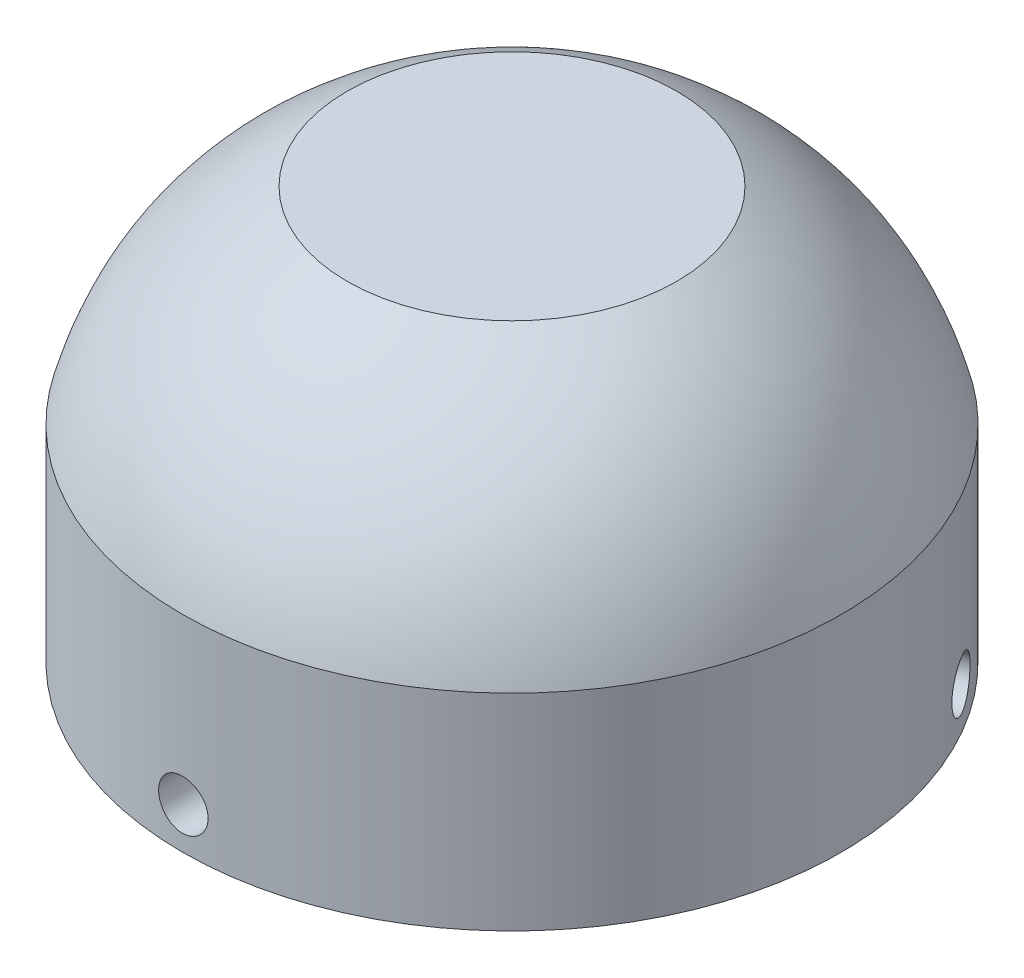
ISO-10303-21;
HEADER;
FILE_DESCRIPTION(('STEP AP214'),'2;1');
FILE_NAME('part.step','',(''),(''),'','','');
FILE_SCHEMA(('AUTOMOTIVE_DESIGN { 1 0 10303 214 1 1 1 1 }'));
ENDSEC;
DATA;
#1=APPLICATION_CONTEXT('core data for automotive mechanical design processes');
#2=APPLICATION_PROTOCOL_DEFINITION('international standard','automotive_design',2000,#1);
#3=PRODUCT_CONTEXT('',#1,'mechanical');
#4=PRODUCT('Part','Part','',(#3));
#5=PRODUCT_RELATED_PRODUCT_CATEGORY('part','',(#4));
#6=PRODUCT_DEFINITION_FORMATION('','',#4);
#7=PRODUCT_DEFINITION_CONTEXT('part definition',#1,'design');
#8=PRODUCT_DEFINITION('design','',#6,#7);
#9=PRODUCT_DEFINITION_SHAPE('','',#8);
#10=(LENGTH_UNIT() NAMED_UNIT(*) SI_UNIT(.MILLI.,.METRE.));
#11=(NAMED_UNIT(*) PLANE_ANGLE_UNIT() SI_UNIT($,.RADIAN.));
#12=(NAMED_UNIT(*) SI_UNIT($,.STERADIAN.) SOLID_ANGLE_UNIT());
#13=UNCERTAINTY_MEASURE_WITH_UNIT(LENGTH_MEASURE(1.E-05),#10,'distance_accuracy_value','');
#14=(GEOMETRIC_REPRESENTATION_CONTEXT(3) GLOBAL_UNCERTAINTY_ASSIGNED_CONTEXT((#13)) GLOBAL_UNIT_ASSIGNED_CONTEXT((#10,
#11,#12)) REPRESENTATION_CONTEXT('',''));
#15=CARTESIAN_POINT('',(0.,0.,0.));
#16=DIRECTION('',(0.,0.,1.));
#17=DIRECTION('',(1.,0.,0.));
#18=AXIS2_PLACEMENT_3D('',#15,#16,#17);
#19=CARTESIAN_POINT('',(-20.,30.,0.));
#20=CARTESIAN_POINT('',(-35.4489346182835,21.9814307012014,0.));
#21=CARTESIAN_POINT('',(-40.,5.,0.));
#22=B_SPLINE_CURVE_WITH_KNOTS('',2,(#19,#20,#21),.UNSPECIFIED.,.F.,.F.,(3,3),(0.,1.),.UNSPECIFIED.);
#23=CARTESIAN_POINT('',(0.,-63.9534883720931,0.));
#24=DIRECTION('',(0.,-1.,0.));
#25=AXIS1_PLACEMENT('',#23,#24);
#26=SURFACE_OF_REVOLUTION('',#22,#25);
#27=CARTESIAN_POINT('',(0.,5.,0.));
#28=DIRECTION('',(0.,-1.,0.));
#29=DIRECTION('',(0.,0.,-1.));
#30=AXIS2_PLACEMENT_3D('',#27,#28,#29);
#31=CIRCLE('',#30,40.);
#32=CARTESIAN_POINT('',(0.,5.,-40.));
#33=VERTEX_POINT('',#32);
#34=EDGE_CURVE('E53',#33,#33,#31,.T.);
#35=ORIENTED_EDGE('',*,*,#34,.F.);
#36=EDGE_LOOP('',(#35));
#37=FACE_BOUND('',#36,.T.);
#38=CARTESIAN_POINT('',(0.,30.,0.));
#39=DIRECTION('',(0.,-1.,0.));
#40=DIRECTION('',(0.,0.,-1.));
#41=AXIS2_PLACEMENT_3D('',#38,#39,#40);
#42=CIRCLE('',#41,20.);
#43=CARTESIAN_POINT('',(0.,30.,-20.));
#44=VERTEX_POINT('',#43);
#45=EDGE_CURVE('E10',#44,#44,#42,.T.);
#46=ORIENTED_EDGE('',*,*,#45,.T.);
#47=EDGE_LOOP('',(#46));
#48=FACE_BOUND('',#47,.T.);
#49=ADVANCED_FACE('F30',(#37,#48),#26,.T.);
#50=CARTESIAN_POINT('',(-20.,30.,0.));
#51=DIRECTION('',(0.,-1.,0.));
#52=DIRECTION('',(0.,0.,-1.));
#53=AXIS2_PLACEMENT_3D('',#50,#51,#52);
#54=PLANE('',#53);
#55=ORIENTED_EDGE('',*,*,#45,.F.);
#56=EDGE_LOOP('',(#55));
#57=FACE_BOUND('',#56,.T.);
#58=ADVANCED_FACE('F77',(#57),#54,.F.);
#59=CARTESIAN_POINT('',(0.,22.9289321881345,0.));
#60=DIRECTION('',(0.,1.,0.));
#61=DIRECTION('',(0.,0.,1.));
#62=AXIS2_PLACEMENT_3D('',#59,#60,#61);
#63=PLANE('',#62);
#64=CARTESIAN_POINT('',(0.,22.9289321881345,0.));
#65=DIRECTION('',(0.,-1.,0.));
#66=DIRECTION('',(0.,0.,-1.));
#67=AXIS2_PLACEMENT_3D('',#64,#65,#66);
#68=CIRCLE('',#67,20.);
#69=CARTESIAN_POINT('',(0.,22.9289321881345,-20.));
#70=VERTEX_POINT('',#69);
#71=EDGE_CURVE('E37',#70,#70,#68,.T.);
#72=ORIENTED_EDGE('',*,*,#71,.T.);
#73=EDGE_LOOP('',(#72));
#74=FACE_BOUND('',#73,.T.);
#75=ADVANCED_FACE('F73',(#74),#63,.F.);
#76=CARTESIAN_POINT('',(-35.,0.,0.));
#77=CARTESIAN_POINT('',(-32.9925107798446,14.5797364340656,0.));
#78=CARTESIAN_POINT('',(-20.,22.9289321881345,0.));
#79=B_SPLINE_CURVE_WITH_KNOTS('',2,(#76,#77,#78),.UNSPECIFIED.,.F.,.F.,(3,3),(0.,1.),.UNSPECIFIED.);
#80=CARTESIAN_POINT('',(0.,-63.9534883720931,0.));
#81=DIRECTION('',(0.,-1.,0.));
#82=AXIS1_PLACEMENT('',#80,#81);
#83=SURFACE_OF_REVOLUTION('',#79,#82);
#84=ORIENTED_EDGE('',*,*,#71,.F.);
#85=EDGE_LOOP('',(#84));
#86=FACE_BOUND('',#85,.T.);
#87=CARTESIAN_POINT('',(0.,0.,0.));
#88=DIRECTION('',(0.,-1.,0.));
#89=DIRECTION('',(0.,0.,-1.));
#90=AXIS2_PLACEMENT_3D('',#87,#88,#89);
#91=CIRCLE('',#90,35.);
#92=CARTESIAN_POINT('',(0.,0.,-35.));
#93=VERTEX_POINT('',#92);
#94=EDGE_CURVE('E41',#93,#93,#91,.T.);
#95=ORIENTED_EDGE('',*,*,#94,.T.);
#96=EDGE_LOOP('',(#95));
#97=FACE_BOUND('',#96,.T.);
#98=ADVANCED_FACE('F68',(#86,#97),#83,.T.);
#99=CARTESIAN_POINT('',(0.,-63.9534883720931,0.));
#100=DIRECTION('',(0.,-1.,0.));
#101=DIRECTION('',(0.,0.,-1.));
#102=AXIS2_PLACEMENT_3D('',#99,#100,#101);
#103=CYLINDRICAL_SURFACE('',#102,35.);
#104=CARTESIAN_POINT('',(-31.6993377410829,-15.,-14.8375195628095));
#105=CARTESIAN_POINT('',(-31.6993355474285,-15.1681788977969,-14.8375267706995));
#106=CARTESIAN_POINT('',(-31.6933079127272,-15.3364718555865,-14.8504230419554));
#107=CARTESIAN_POINT('',(-31.6692637457543,-15.668400071108,-14.9016275265098));
#108=CARTESIAN_POINT('',(-31.6512336780235,-15.8320298525538,-14.9399644297251));
#109=CARTESIAN_POINT('',(-31.6034490090532,-16.1497763164806,-15.0407813611578));
#110=CARTESIAN_POINT('',(-31.5737011153164,-16.3038983830823,-15.1032475769103));
#111=CARTESIAN_POINT('',(-31.5029384740131,-16.5983417986807,-15.2502948544938));
#112=CARTESIAN_POINT('',(-31.4619261125039,-16.7386660618111,-15.3348712327325));
#113=CARTESIAN_POINT('',(-31.3691852996159,-17.0019468210089,-15.5237003256633));
#114=CARTESIAN_POINT('',(-31.3174313409714,-17.1248607834929,-15.6279998219832));
#115=CARTESIAN_POINT('',(-31.2041875525536,-17.3494663357357,-15.8529018638792));
#116=CARTESIAN_POINT('',(-31.1426972950232,-17.4511569926087,-15.9735051257153));
#117=CARTESIAN_POINT('',(-31.0110951669304,-17.6305716963779,-16.2275209844633));
#118=CARTESIAN_POINT('',(-30.9409702379859,-17.7082588039076,-16.3609529139425));
#119=CARTESIAN_POINT('',(-30.7937213671833,-17.8372248736093,-16.6364386863232));
#120=CARTESIAN_POINT('',(-30.7165975541843,-17.8885043218666,-16.7784923704705));
#121=CARTESIAN_POINT('',(-30.5574353417916,-17.9630766244091,-17.0666386367993));
#122=CARTESIAN_POINT('',(-30.4754095859762,-17.9864384709037,-17.2127203457848));
#123=CARTESIAN_POINT('',(-30.3084643635952,-18.0047257169121,-17.5050080891657));
#124=CARTESIAN_POINT('',(-30.2235449536737,-17.9996516727498,-17.6512141210729));
#125=CARTESIAN_POINT('',(-30.0534929178141,-17.9612675389711,-17.9392158507807));
#126=CARTESIAN_POINT('',(-29.9683614375479,-17.9280316396164,-18.0810221228558));
#127=CARTESIAN_POINT('',(-29.8002772342064,-17.834382628761,-18.3567307075397));
#128=CARTESIAN_POINT('',(-29.7173245328857,-17.7739692460094,-18.4906329412455));
#129=CARTESIAN_POINT('',(-29.55618139008,-17.627597672851,-18.7471368054528));
#130=CARTESIAN_POINT('',(-29.477997293087,-17.5416063081392,-18.8697234876029));
#131=CARTESIAN_POINT('',(-29.329165252444,-17.3465438378033,-19.1002334962758));
#132=CARTESIAN_POINT('',(-29.2585174707027,-17.2374722364782,-19.208156507781));
#133=CARTESIAN_POINT('',(-29.1270479808863,-16.9989274115879,-19.4069408928311));
#134=CARTESIAN_POINT('',(-29.0662586003546,-16.8693897117684,-19.4977462864927));
#135=CARTESIAN_POINT('',(-28.9570303549841,-16.593814336155,-19.6596021787964));
#136=CARTESIAN_POINT('',(-28.9085915012042,-16.4477766455869,-19.7306526597495));
#137=CARTESIAN_POINT('',(-28.8259114332634,-16.1433008088582,-19.851251929562));
#138=CARTESIAN_POINT('',(-28.7916721174494,-15.9848610080139,-19.9007978435008));
#139=CARTESIAN_POINT('',(-28.7387492014963,-15.6601005113749,-19.9771487298717));
#140=CARTESIAN_POINT('',(-28.7200652550904,-15.4937799910943,-20.0039542085124));
#141=CARTESIAN_POINT('',(-28.6990351966099,-15.1585451904919,-20.034113967633));
#142=CARTESIAN_POINT('',(-28.6966373460487,-14.9896408341738,-20.0375425132618));
#143=CARTESIAN_POINT('',(-28.7081384662056,-14.6535358314843,-20.0210609820554));
#144=CARTESIAN_POINT('',(-28.72203727597,-14.4863351683029,-20.0011511357218));
#145=CARTESIAN_POINT('',(-28.7655415502781,-14.1586431948189,-19.9385318969368));
#146=CARTESIAN_POINT('',(-28.795123020415,-13.9981420378853,-19.8958573337914));
#147=CARTESIAN_POINT('',(-28.8688165582247,-13.6880999611053,-19.7887753633423));
#148=CARTESIAN_POINT('',(-28.9129288723111,-13.538559227178,-19.7243675874873));
#149=CARTESIAN_POINT('',(-29.0141241073333,-13.2542704319917,-19.5752066212797));
#150=CARTESIAN_POINT('',(-29.0712393280241,-13.1195604686071,-19.4904027360352));
#151=CARTESIAN_POINT('',(-29.1962526638784,-12.8691423551176,-19.302629847062));
#152=CARTESIAN_POINT('',(-29.264150975257,-12.7534345508645,-19.1996605127808));
#153=CARTESIAN_POINT('',(-29.408483781682,-12.5439970271157,-18.9778450451139));
#154=CARTESIAN_POINT('',(-29.4849402660236,-12.450325934563,-18.858957851517));
#155=CARTESIAN_POINT('',(-29.64359052085,-12.2880232282786,-18.6085860631289));
#156=CARTESIAN_POINT('',(-29.7257842311431,-12.2193913518968,-18.4771016004956));
#157=CARTESIAN_POINT('',(-29.8930681082947,-12.1092157912916,-18.2052162901554));
#158=CARTESIAN_POINT('',(-29.9781542500806,-12.067635964639,-18.0648276152972));
#159=CARTESIAN_POINT('',(-30.1486478856728,-12.0126266986178,-17.7788282380026));
#160=CARTESIAN_POINT('',(-30.234055372974,-11.9991966924382,-17.6332176407723));
#161=CARTESIAN_POINT('',(-30.4023938789932,-12.0008750821372,-17.3413591599725));
#162=CARTESIAN_POINT('',(-30.4853319569704,-12.0158921579829,-17.1951148142023));
#163=CARTESIAN_POINT('',(-30.6467547280445,-12.0738478591427,-16.9057352857155));
#164=CARTESIAN_POINT('',(-30.7252394153858,-12.1167865205418,-16.7626001070173));
#165=CARTESIAN_POINT('',(-30.8757911074189,-12.2293430218768,-16.4836483809795));
#166=CARTESIAN_POINT('',(-30.947858540913,-12.298959077572,-16.3478313448797));
#167=CARTESIAN_POINT('',(-31.0839547837021,-12.4628838846323,-16.0875526619888));
#168=CARTESIAN_POINT('',(-31.1479837094471,-12.5571922782303,-15.9630908507072));
#169=CARTESIAN_POINT('',(-31.2668889101178,-12.7681675615409,-15.7289219638973));
#170=CARTESIAN_POINT('',(-31.3217365219968,-12.8849021138727,-15.6192612949511));
#171=CARTESIAN_POINT('',(-31.4210438574192,-13.1372917927201,-15.4185142419734));
#172=CARTESIAN_POINT('',(-31.465501065205,-13.2729514887808,-15.3274323569737));
#173=CARTESIAN_POINT('',(-31.5433425985919,-13.5596186650064,-15.1665936200246));
#174=CARTESIAN_POINT('',(-31.5767050499487,-13.7106557064792,-15.096878916213));
#175=CARTESIAN_POINT('',(-31.6316899560069,-14.0234732227605,-14.9813324820185));
#176=CARTESIAN_POINT('',(-31.653325875478,-14.1852411353663,-14.9354733623551));
#177=CARTESIAN_POINT('',(-31.6790654713475,-14.4566320780792,-14.8807707644004));
#178=CARTESIAN_POINT('',(-31.6866617646195,-14.564510957119,-14.8645757059903));
#179=CARTESIAN_POINT('',(-31.6967986046329,-14.781577186907,-14.8429477798276));
#180=CARTESIAN_POINT('',(-31.6993391659042,-14.890764533894,-14.8375148811447));
#181=CARTESIAN_POINT('',(-31.6993377410829,-15.,-14.8375195628095));
#182=B_SPLINE_CURVE_WITH_KNOTS('',3,(#104,#105,#106,#107,#108,#109,#110,#111,#112,#113,#114,
#115,#116,#117,#118,#119,#120,#121,#122,#123,#124,#125,#126,#127,#128,#129,#130,#131,#132,#133,
#134,#135,#136,#137,#138,#139,#140,#141,#142,#143,#144,#145,#146,#147,#148,#149,#150,#151,#152,
#153,#154,#155,#156,#157,#158,#159,#160,#161,#162,#163,#164,#165,#166,#167,#168,#169,#170,#171,
#172,#173,#174,#175,#176,#177,#178,#179,#180,#181),.UNSPECIFIED.,.T.,.F.,(4,2,2,2,2,2,2,2,2,2,2,
2,2,2,2,2,2,2,2,2,2,2,2,2,2,2,2,2,2,2,2,2,2,2,2,2,2,2,4),(0.,0.504137845154906,1.0088451851254,
1.51326404003696,2.01757613044269,2.52309976273197,3.02864561100071,3.5349656192069,
4.04127630725863,4.54633315507159,5.05138012191659,5.55510070289603,6.05882631148134,
6.56320811562687,7.06760075362891,7.57361533214637,8.07963036375614,8.58571302310648,
9.09178441661877,9.5962473420388,10.1007052851759,10.6043936277359,11.1080905122643,
11.6130525231886,12.1180237237333,12.6243235404852,13.1306180462274,13.6362347291713,
14.1418412311696,14.6458273992463,15.1498142186598,15.6537673362459,16.1577131524622,
16.6632040203355,17.1688171527569,17.6754213142689,18.1814425380561,18.5088908177618,
18.836338156391),.UNSPECIFIED.);
#183=CARTESIAN_POINT('',(-31.6993377410829,-15.,-14.8375195628095));
#184=VERTEX_POINT('',#183);
#185=EDGE_CURVE('E126',#184,#184,#182,.T.);
#186=ORIENTED_EDGE('',*,*,#185,.F.);
#187=EDGE_LOOP('',(#186));
#188=FACE_BOUND('',#187,.T.);
#189=CARTESIAN_POINT('',(28.6993377410832,-15.,-20.0336719855157));
#190=CARTESIAN_POINT('',(28.6993428864718,-15.1681788977969,-20.0336664818103));
#191=CARTESIAN_POINT('',(28.7074975676428,-15.3364718555865,-20.0219982614063));
#192=CARTESIAN_POINT('',(28.7398198685682,-15.668400071108,-19.9755731597177));
#193=CARTESIAN_POINT('',(28.7640055667897,-15.8320298525538,-19.9407902114232));
#194=CARTESIAN_POINT('',(28.8274232560568,-16.1497763164806,-19.8489990084672));
#195=CARTESIAN_POINT('',(28.8666466389084,-16.3038983830823,-19.7920034689058));
#196=CARTESIAN_POINT('',(28.9586119962014,-16.5983417986807,-19.6571975851065));
#197=CARTESIAN_POINT('',(29.0113511075616,-16.7386660618111,-19.579391649051));
#198=CARTESIAN_POINT('',(29.1285114925692,-17.0019468210089,-19.404661202657));
#199=CARTESIAN_POINT('',(29.1929605266619,-17.1248607834929,-19.3076912115644));
#200=CARTESIAN_POINT('',(29.331109514098,-17.3494663357357,-19.0971681930259));
#201=CARTESIAN_POINT('',(29.4048098738621,-17.4511569926087,-18.9836144370013));
#202=CARTESIAN_POINT('',(29.5589929964556,-17.6305716963779,-18.7426357215068));
#203=CARTESIAN_POINT('',(29.6394859725883,-17.7082588039076,-18.6151897868627));
#204=CARTESIAN_POINT('',(29.8044392144499,-17.8372248736093,-18.3499256378787));
#205=CARTESIAN_POINT('',(29.888899407123,-17.8885043218666,-18.2121076145111));
#206=CARTESIAN_POINT('',(30.0588602875731,-17.9630766244092,-17.9301959620922));
#207=CARTESIAN_POINT('',(30.144357880675,-17.9864384709037,-17.7861187192987));
#208=CARTESIAN_POINT('',(30.3140138804673,-18.0047257169121,-17.4953960439858));
#209=CARTESIAN_POINT('',(30.3981723133247,-17.9996516727498,-17.3487506617658));
#210=CARTESIAN_POINT('',(30.5625631096557,-17.9612675389711,-17.0574804138922));
#211=CARTESIAN_POINT('',(30.6428052035556,-17.9280316396164,-16.9128512532824));
#212=CARTESIAN_POINT('',(30.7975337402626,-17.834382628761,-16.6294317708718));
#213=CARTESIAN_POINT('',(30.8720201256149,-17.7739692460094,-16.4906415073626));
#214=CARTESIAN_POINT('',(31.0135874167845,-17.627597672851,-16.2228355199436));
#215=CARTESIAN_POINT('',(31.0806585491956,-17.5416063081392,-16.0938327647007));
#216=CARTESIAN_POINT('',(31.2058700522114,-17.3465438378033,-15.8496854322703));
#217=CARTESIAN_POINT('',(31.2640102309571,-17.2374722364782,-15.7345411528087));
#218=CARTESIAN_POINT('',(31.370427813378,-16.9989274115879,-15.5212930422801));
#219=CARTESIAN_POINT('',(31.4186729008238,-16.8693897117684,-15.4232451976285));
#220=CARTESIAN_POINT('',(31.5042300926257,-16.593814336155,-15.247722816175));
#221=CARTESIAN_POINT('',(31.5415421871923,-16.4477766455869,-15.1702482977949));
#222=CARTESIAN_POINT('',(31.6046441845573,-16.1433008088582,-15.0383456236652));
#223=CARTESIAN_POINT('',(31.630432546775,-15.9848610080139,-14.9839205493927));
#224=CARTESIAN_POINT('',(31.6700928959972,-15.6601005113749,-14.8999125165495));
#225=CARTESIAN_POINT('',(31.6839651482577,-15.4937799910943,-14.8703290049988));
#226=CARTESIAN_POINT('',(31.6995692365879,-15.1585451904919,-14.8370365605512));
#227=CARTESIAN_POINT('',(31.7013395189198,-14.9896408341738,-14.8332456882364));
#228=CARTESIAN_POINT('',(31.6928166542803,-14.6535358314843,-14.8514467160674));
#229=CARTESIAN_POINT('',(31.6825236264521,-14.4863351683029,-14.8734383615725));
#230=CARTESIAN_POINT('',(31.6500459120528,-14.1586431948189,-14.9424237876891));
#231=CARTESIAN_POINT('',(31.6278793913418,-13.9981420378853,-14.9893793738816));
#232=CARTESIAN_POINT('',(31.5719904535505,-13.6880999611053,-15.1067408349441));
#233=CARTESIAN_POINT('',(31.538267840502,-13.538559227178,-15.1771471074902));
#234=CARTESIAN_POINT('',(31.4596882720242,-13.2542704319917,-15.3393652348652));
#235=CARTESIAN_POINT('',(31.4148035634084,-13.1195604686071,-15.4312304095484));
#236=CARTESIAN_POINT('',(31.3146941393427,-12.8691423551176,-15.6333815786967));
#237=CARTESIAN_POINT('',(31.2594692357337,-12.7534345508645,-15.7436679083651));
#238=CARTESIAN_POINT('',(31.1395378089943,-12.5439970271157,-15.9795715191622));
#239=CARTESIAN_POINT('',(31.0748067213256,-12.450325934563,-16.1052283736845));
#240=CARTESIAN_POINT('',(30.9373035196037,-12.2880232282786,-16.3678094188751));
#241=CARTESIAN_POINT('',(30.864531489907,-12.2193913518968,-16.5047334913369));
#242=CARTESIAN_POINT('',(30.7127138428123,-12.1092157912916,-16.7855482337638));
#243=CARTESIAN_POINT('',(30.6336767548744,-12.067635964639,-16.9294293314895));
#244=CARTESIAN_POINT('',(30.4712408464668,-12.0126266986178,-17.2200808397433));
#245=CARTESIAN_POINT('',(30.3878421138558,-11.9991966924382,-17.3668511920346));
#246=CARTESIAN_POINT('',(30.2192545081828,-12.0008750821372,-17.6585658550822));
#247=CARTESIAN_POINT('',(30.1340722285746,-12.0158921579829,-17.8035145104366));
#248=CARTESIAN_POINT('',(29.9641735911069,-12.0738478591427,-18.0880004951795));
#249=CARTESIAN_POINT('',(29.8794572338497,-12.1167865205418,-18.2275378175742));
#250=CARTESIAN_POINT('',(29.713153798688,-12.2293430218768,-18.4973952704765));
#251=CARTESIAN_POINT('',(29.631566511906,-12.298959077572,-18.6277160167179));
#252=CARTESIAN_POINT('',(29.4742066818535,-12.4628838846323,-18.8757181617783));
#253=CARTESIAN_POINT('',(29.398434054355,-12.5571922782303,-18.9933997436913));
#254=CARTESIAN_POINT('',(29.2550904499371,-12.7681675615409,-19.2134591115192));
#255=CARTESIAN_POINT('',(29.1875453307732,-12.8849021138727,-19.3157888712164));
#256=CARTESIAN_POINT('',(29.0633469508708,-13.1372917927201,-19.5021650729632));
#257=CARTESIAN_POINT('',(29.0066963285294,-13.2729514887808,-19.5862070867868));
#258=CARTESIAN_POINT('',(28.9063266631123,-13.5596186650063,-19.734039200644));
#259=CARTESIAN_POINT('',(28.8626331842726,-13.7106557064792,-19.7977892829573));
#260=CARTESIAN_POINT('',(28.7900594899725,-14.0234732227605,-19.9031808255257));
#261=CARTESIAN_POINT('',(28.7611622870844,-14.1852411353663,-19.9448476412536));
#262=CARTESIAN_POINT('',(28.7266582455373,-14.4566320780792,-19.994490084137));
#263=CARTESIAN_POINT('',(28.7164310601745,-14.564510957119,-20.0091661962902));
#264=CARTESIAN_POINT('',(28.702769146693,-14.781577186907,-20.0287589203373));
#265=CARTESIAN_POINT('',(28.6993343990532,-14.890764533894,-20.0336755602795));
#266=CARTESIAN_POINT('',(28.6993377410832,-15.,-20.0336719855157));
#267=B_SPLINE_CURVE_WITH_KNOTS('',3,(#189,#190,#191,#192,#193,#194,#195,#196,#197,#198,#199,
#200,#201,#202,#203,#204,#205,#206,#207,#208,#209,#210,#211,#212,#213,#214,#215,#216,#217,#218,
#219,#220,#221,#222,#223,#224,#225,#226,#227,#228,#229,#230,#231,#232,#233,#234,#235,#236,#237,
#238,#239,#240,#241,#242,#243,#244,#245,#246,#247,#248,#249,#250,#251,#252,#253,#254,#255,#256,
#257,#258,#259,#260,#261,#262,#263,#264,#265,#266),.UNSPECIFIED.,.T.,.F.,(4,2,2,2,2,2,2,2,2,2,2,
2,2,2,2,2,2,2,2,2,2,2,2,2,2,2,2,2,2,2,2,2,2,2,2,2,2,2,4),(0.,0.504137845154905,1.00884518512539,
1.51326404003695,2.01757613044268,2.52309976273196,3.02864561100069,3.53496561920689,
4.04127630725862,4.54633315507159,5.0513801219166,5.55510070289604,6.05882631148134,
6.56320811562687,7.06760075362892,7.57361533214637,8.07963036375613,8.58571302310648,
9.09178441661877,9.5962473420388,10.1007052851759,10.6043936277359,11.1080905122643,
11.6130525231886,12.1180237237333,12.6243235404852,13.1306180462274,13.6362347291713,
14.1418412311696,14.6458273992463,15.1498142186598,15.6537673362459,16.1577131524622,
16.6632040203355,17.1688171527569,17.6754213142688,18.1814425380561,18.5088908177617,
18.836338156391),.UNSPECIFIED.);
#268=CARTESIAN_POINT('',(28.6993377410832,-15.,-20.0336719855157));
#269=VERTEX_POINT('',#268);
#270=EDGE_CURVE('E131',#269,#269,#267,.T.);
#271=ORIENTED_EDGE('',*,*,#270,.F.);
#272=EDGE_LOOP('',(#271));
#273=FACE_BOUND('',#272,.T.);
#274=CARTESIAN_POINT('',(3.,-15.,34.8711915483254));
#275=CARTESIAN_POINT('',(2.99999266095691,-15.1681788977969,34.8711932525099));
#276=CARTESIAN_POINT('',(2.98581034508464,-15.3364718555865,34.8724213033618));
#277=CARTESIAN_POINT('',(2.92944387718635,-15.668400071108,34.8772006862277));
#278=CARTESIAN_POINT('',(2.88722811123404,-15.8320298525538,34.8807546411484));
#279=CARTESIAN_POINT('',(2.77602575299662,-16.1497763164806,34.8897803696251));
#280=CARTESIAN_POINT('',(2.70705447640827,-16.3038983830823,34.8952510458163));
#281=CARTESIAN_POINT('',(2.54432647781201,-16.5983417986807,34.9074924396004));
#282=CARTESIAN_POINT('',(2.45057500494258,-16.7386660618111,34.9142628817836));
#283=CARTESIAN_POINT('',(2.24067380704696,-17.0019468210089,34.9283615283204));
#284=CARTESIAN_POINT('',(2.12447081430968,-17.1248607834929,34.9356910335478));
#285=CARTESIAN_POINT('',(1.87307803845591,-17.3494663357357,34.9500700569052));
#286=CARTESIAN_POINT('',(1.73788742116142,-17.4511569926087,34.9571195627167));
#287=CARTESIAN_POINT('',(1.45210217047511,-17.6305716963779,34.9701567059702));
#288=CARTESIAN_POINT('',(1.3014842653979,-17.7082588039076,34.9761427008053));
#289=CARTESIAN_POINT('',(0.98928215273371,-17.8372248736093,34.9863643242021));
#290=CARTESIAN_POINT('',(0.827698147061469,-17.8885043218666,34.9905999849818));
#291=CARTESIAN_POINT('',(0.498575054218781,-17.9630766244091,34.9968345988916));
#292=CARTESIAN_POINT('',(0.331051705301399,-17.9864384709037,34.9988390650836));
#293=CARTESIAN_POINT('',(-0.00554951687181906,-18.0047257169121,35.0004041331516));
#294=CARTESIAN_POINT('',(-0.17462735965071,-17.9996516727498,34.9999647828389));
#295=CARTESIAN_POINT('',(-0.509070191841328,-17.9612675389711,34.9966962646731));
#296=CARTESIAN_POINT('',(-0.674443766007424,-17.9280316396164,34.9938733761383));
#297=CARTESIAN_POINT('',(-0.99725650605593,-17.834382628761,34.9861624784117));
#298=CARTESIAN_POINT('',(-1.154695592729,-17.7739692460094,34.9812744486083));
#299=CARTESIAN_POINT('',(-1.45740602670417,-17.627597672851,34.9699723253966));
#300=CARTESIAN_POINT('',(-1.6026612561083,-17.5416063081392,34.9635562523037));
#301=CARTESIAN_POINT('',(-1.87670479976716,-17.3465438378033,34.9499189285463));
#302=CARTESIAN_POINT('',(-2.0054927602542,-17.2374722364782,34.9426976605898));
#303=CARTESIAN_POINT('',(-2.24337983249144,-16.9989274115879,34.9282339351113));
#304=CARTESIAN_POINT('',(-2.35241430046894,-16.8693897117684,34.9209914841214));
#305=CARTESIAN_POINT('',(-2.54719973764136,-16.593814336155,34.9073249949716));
#306=CARTESIAN_POINT('',(-2.63295068598784,-16.4477766455869,34.9009009575446));
#307=CARTESIAN_POINT('',(-2.77873275129373,-16.1433008088582,34.8895975532274));
#308=CARTESIAN_POINT('',(-2.83876042932541,-15.9848610080139,34.8847183928937));
#309=CARTESIAN_POINT('',(-2.93134369450066,-15.6601005113749,34.8770612464214));
#310=CARTESIAN_POINT('',(-2.96389989316699,-15.4937799910943,34.8742832135113));
#311=CARTESIAN_POINT('',(-3.00053403997774,-15.1585451904919,34.8711505281844));
#312=CARTESIAN_POINT('',(-3.00470217287089,-14.9896408341738,34.8707882014983));
#313=CARTESIAN_POINT('',(-2.98467818807446,-14.6535358314843,34.872507698123));
#314=CARTESIAN_POINT('',(-2.96048635048195,-14.4863351683029,34.8745894972945));
#315=CARTESIAN_POINT('',(-2.88450436177439,-14.1586431948189,34.8809556846261));
#316=CARTESIAN_POINT('',(-2.8327563709266,-13.9981420378853,34.8852367076732));
#317=CARTESIAN_POINT('',(-2.70317389532559,-13.6880999611053,34.8955161982866));
#318=CARTESIAN_POINT('',(-2.62533896819065,-13.538559227178,34.9015146949777));
#319=CARTESIAN_POINT('',(-2.44556416469073,-13.2542704319917,34.914571856145));
#320=CARTESIAN_POINT('',(-2.34356423538402,-13.1195604686071,34.9216331455838));
#321=CARTESIAN_POINT('',(-2.11844147546403,-12.8691423551176,34.9360114257588));
#322=CARTESIAN_POINT('',(-1.99531826047652,-12.7534345508645,34.9433284211461));
#323=CARTESIAN_POINT('',(-1.7310540273121,-12.5439970271157,34.9574165642762));
#324=CARTESIAN_POINT('',(-1.58986645530174,-12.450325934563,34.9641862252016));
#325=CARTESIAN_POINT('',(-1.2937129987535,-12.2880232282786,34.9763954820041));
#326=CARTESIAN_POINT('',(-1.1387472587636,-12.2193913518968,34.9818350918326));
#327=CARTESIAN_POINT('',(-0.819645734517392,-12.1092157912916,34.9907645239193));
#328=CARTESIAN_POINT('',(-0.655522504793544,-12.067635964639,34.9942569467868));
#329=CARTESIAN_POINT('',(-0.322592960793772,-12.0126266986178,34.998909077746));
#330=CARTESIAN_POINT('',(-0.153786740881575,-11.9991966924382,35.000068832807));
#331=CARTESIAN_POINT('',(0.183139370810557,-12.0008750821372,34.9999250150549));
#332=CARTESIAN_POINT('',(0.351259728396026,-12.0158921579829,34.9986293246391));
#333=CARTESIAN_POINT('',(0.682581136937831,-12.0738478591427,34.9937357808951));
#334=CARTESIAN_POINT('',(0.845782181536318,-12.1167865205418,34.9901379245917));
#335=CARTESIAN_POINT('',(1.16263730873111,-12.2293430218768,34.9810436514562));
#336=CARTESIAN_POINT('',(1.31629202900732,-12.298959077572,34.9755473615977));
#337=CARTESIAN_POINT('',(1.60974810184892,-12.4628838846323,34.9632708237673));
#338=CARTESIAN_POINT('',(1.74954965509232,-12.5571922782303,34.9564905943986));
#339=CARTESIAN_POINT('',(2.01179846018098,-12.7681675615409,34.9423810754166));
#340=CARTESIAN_POINT('',(2.13419119122391,-12.8849021138727,34.9350501661676));
#341=CARTESIAN_POINT('',(2.35769690654864,-13.1372917927201,34.9206793149367));
#342=CARTESIAN_POINT('',(2.45880473667584,-13.2729514887808,34.9136394437606));
#343=CARTESIAN_POINT('',(2.63701593547982,-13.5596186650063,34.9006328206687));
#344=CARTESIAN_POINT('',(2.71407186567635,-13.7106557064792,34.8946681991704));
#345=CARTESIAN_POINT('',(2.84163046603466,-14.0234732227605,34.8845133075443));
#346=CARTESIAN_POINT('',(2.89216358839389,-14.1852411353663,34.8803210036088));
#347=CARTESIAN_POINT('',(2.95240722581038,-14.4566320780792,34.8752608485375));
#348=CARTESIAN_POINT('',(2.97023070444527,-14.564510957119,34.8737419022807));
#349=CARTESIAN_POINT('',(2.9940294579401,-14.781577186907,34.871706700165));
#350=CARTESIAN_POINT('',(3.00000476685127,-14.890764533894,34.8711904414244));
#351=CARTESIAN_POINT('',(3.,-15.,34.8711915483254));
#352=B_SPLINE_CURVE_WITH_KNOTS('',3,(#274,#275,#276,#277,#278,#279,#280,#281,#282,#283,#284,
#285,#286,#287,#288,#289,#290,#291,#292,#293,#294,#295,#296,#297,#298,#299,#300,#301,#302,#303,
#304,#305,#306,#307,#308,#309,#310,#311,#312,#313,#314,#315,#316,#317,#318,#319,#320,#321,#322,
#323,#324,#325,#326,#327,#328,#329,#330,#331,#332,#333,#334,#335,#336,#337,#338,#339,#340,#341,
#342,#343,#344,#345,#346,#347,#348,#349,#350,#351),.UNSPECIFIED.,.T.,.F.,(4,2,2,2,2,2,2,2,2,2,2,
2,2,2,2,2,2,2,2,2,2,2,2,2,2,2,2,2,2,2,2,2,2,2,2,2,2,2,4),(0.,0.504137845154905,1.00884518512539,
1.51326404003696,2.01757613044269,2.52309976273197,3.0286456110007,3.53496561920689,
4.04127630725863,4.54633315507159,5.0513801219166,5.55510070289603,6.05882631148133,
6.56320811562686,7.06760075362891,7.57361533214636,8.07963036375614,8.58571302310648,
9.09178441661877,9.5962473420388,10.1007052851759,10.6043936277359,11.1080905122643,
11.6130525231886,12.1180237237333,12.6243235404852,13.1306180462274,13.6362347291713,
14.1418412311696,14.6458273992463,15.1498142186598,15.6537673362459,16.1577131524622,
16.6632040203355,17.1688171527569,17.6754213142688,18.1814425380561,18.5088908177617,
18.836338156391),.UNSPECIFIED.);
#353=CARTESIAN_POINT('',(3.,-15.,34.8711915483254));
#354=VERTEX_POINT('',#353);
#355=EDGE_CURVE('E56',#354,#354,#352,.T.);
#356=ORIENTED_EDGE('',*,*,#355,.F.);
#357=EDGE_LOOP('',(#356));
#358=FACE_BOUND('',#357,.T.);
#359=ORIENTED_EDGE('',*,*,#94,.F.);
#360=EDGE_LOOP('',(#359));
#361=FACE_BOUND('',#360,.T.);
#362=CARTESIAN_POINT('',(0.,-20.,0.));
#363=DIRECTION('',(0.,-1.,0.));
#364=DIRECTION('',(0.,0.,-1.));
#365=AXIS2_PLACEMENT_3D('',#362,#363,#364);
#366=CIRCLE('',#365,35.);
#367=CARTESIAN_POINT('',(0.,-20.,-35.));
#368=VERTEX_POINT('',#367);
#369=EDGE_CURVE('E45',#368,#368,#366,.T.);
#370=ORIENTED_EDGE('',*,*,#369,.T.);
#371=EDGE_LOOP('',(#370));
#372=FACE_BOUND('',#371,.T.);
#373=ADVANCED_FACE('F72',(#188,#273,#358,#361,#372),#103,.F.);
#374=CARTESIAN_POINT('',(-35.,-20.,0.));
#375=DIRECTION('',(0.,1.,0.));
#376=DIRECTION('',(0.,0.,1.));
#377=AXIS2_PLACEMENT_3D('',#374,#375,#376);
#378=PLANE('',#377);
#379=ORIENTED_EDGE('',*,*,#369,.F.);
#380=EDGE_LOOP('',(#379));
#381=FACE_BOUND('',#380,.T.);
#382=CARTESIAN_POINT('',(0.,-20.,0.));
#383=DIRECTION('',(0.,-1.,0.));
#384=DIRECTION('',(0.,0.,-1.));
#385=AXIS2_PLACEMENT_3D('',#382,#383,#384);
#386=CIRCLE('',#385,40.);
#387=CARTESIAN_POINT('',(0.,-20.,-40.));
#388=VERTEX_POINT('',#387);
#389=EDGE_CURVE('E50',#388,#388,#386,.T.);
#390=ORIENTED_EDGE('',*,*,#389,.T.);
#391=EDGE_LOOP('',(#390));
#392=FACE_BOUND('',#391,.T.);
#393=ADVANCED_FACE('F91',(#381,#392),#378,.F.);
#394=CARTESIAN_POINT('',(0.,-63.9534883720931,0.));
#395=DIRECTION('',(0.,-1.,0.));
#396=DIRECTION('',(0.,0.,-1.));
#397=AXIS2_PLACEMENT_3D('',#394,#395,#396);
#398=CYLINDRICAL_SURFACE('',#397,40.);
#399=CARTESIAN_POINT('',(-36.0434508988317,-15.,-17.345594463826));
#400=CARTESIAN_POINT('',(-36.0434485099029,-14.8317431314442,-17.3456015996993));
#401=CARTESIAN_POINT('',(-36.0372814306523,-14.6633702964108,-17.3584324834417));
#402=CARTESIAN_POINT('',(-36.012692785125,-14.3312791687042,-17.4093861957378));
#403=CARTESIAN_POINT('',(-35.9942571691222,-14.1675664371041,-17.4475380212816));
#404=CARTESIAN_POINT('',(-35.9454373561321,-13.8496536331391,-17.5478952755415));
#405=CARTESIAN_POINT('',(-35.9150597301995,-13.6954483832017,-17.6100874758004));
#406=CARTESIAN_POINT('',(-35.8428802841703,-13.4008549890848,-17.756535842124));
#407=CARTESIAN_POINT('',(-35.8010809816004,-13.2604638093195,-17.8407871458263));
#408=CARTESIAN_POINT('',(-35.7067170207569,-12.9971499524325,-18.028905141259));
#409=CARTESIAN_POINT('',(-35.6541324482742,-12.8742603122085,-18.1328080902756));
#410=CARTESIAN_POINT('',(-35.5392589522166,-12.6497213507046,-18.3569304798961));
#411=CARTESIAN_POINT('',(-35.4769696132881,-12.5480729389627,-18.47715061883));
#412=CARTESIAN_POINT('',(-35.343915021324,-12.3687948958306,-18.7304064029074));
#413=CARTESIAN_POINT('',(-35.2731399709938,-12.2911934058109,-18.8634568260775));
#414=CARTESIAN_POINT('',(-35.1247947586744,-12.1623920757591,-19.1382640007978));
#415=CARTESIAN_POINT('',(-35.0472246955477,-12.1111918516826,-19.2800206256702));
#416=CARTESIAN_POINT('',(-34.8873785317623,-12.036740321391,-19.567775599993));
#417=CARTESIAN_POINT('',(-34.8051116423367,-12.0134361540441,-19.7137653882387));
#418=CARTESIAN_POINT('',(-34.6379542723222,-11.9952749155517,-20.0060104969881));
#419=CARTESIAN_POINT('',(-34.5530638322075,-12.0004174057697,-20.1522658133626));
#420=CARTESIAN_POINT('',(-34.3832793116365,-12.0389601217082,-20.440598017982));
#421=CARTESIAN_POINT('',(-34.2983855818404,-12.0723034976842,-20.5826827179069));
#422=CARTESIAN_POINT('',(-34.1310079202001,-12.1662131677969,-20.8590607896552));
#423=CARTESIAN_POINT('',(-34.0485240075631,-12.2267796788492,-20.9933540993866));
#424=CARTESIAN_POINT('',(-33.8885227127553,-12.3734801603667,-21.250671312474));
#425=CARTESIAN_POINT('',(-33.8110103967526,-12.459639722782,-21.3736837735614));
#426=CARTESIAN_POINT('',(-33.6636297460356,-12.6550619611845,-21.6050660641836));
#427=CARTESIAN_POINT('',(-33.5937615364539,-12.7643250152862,-21.7134356540238));
#428=CARTESIAN_POINT('',(-33.4639307435979,-13.0031733593149,-21.9130002114594));
#429=CARTESIAN_POINT('',(-33.4039929733102,-13.1328080238318,-22.0041522350926));
#430=CARTESIAN_POINT('',(-33.2963918719693,-13.4085472746576,-22.1666374512936));
#431=CARTESIAN_POINT('',(-33.2487285484692,-13.5546518711013,-22.2379706316657));
#432=CARTESIAN_POINT('',(-33.1674417589666,-13.8592170087497,-22.3590283895546));
#433=CARTESIAN_POINT('',(-33.1338195822937,-14.0176786830594,-22.4087509826942));
#434=CARTESIAN_POINT('',(-33.0819019062815,-14.3424441612186,-22.4853268872281));
#435=CARTESIAN_POINT('',(-33.063606146597,-14.5087478318077,-22.5121805870898));
#436=CARTESIAN_POINT('',(-33.0430736411475,-14.8440431538149,-22.5423073958953));
#437=CARTESIAN_POINT('',(-33.0407979103687,-15.0130272761831,-22.5456377493711));
#438=CARTESIAN_POINT('',(-33.0522904001772,-15.349267519701,-22.5287860142545));
#439=CARTESIAN_POINT('',(-33.0660584999243,-15.5165236538561,-22.5086041027534));
#440=CARTESIAN_POINT('',(-33.1090812380939,-15.8443631467125,-22.445270932589));
#441=CARTESIAN_POINT('',(-33.1383179166718,-16.0049540114315,-22.402146311314));
#442=CARTESIAN_POINT('',(-33.2111557127067,-16.3151365347476,-22.2940207406841));
#443=CARTESIAN_POINT('',(-33.2547570174012,-16.4647280499414,-22.2290195061757));
#444=CARTESIAN_POINT('',(-33.3548010143253,-16.7489821051146,-22.0786184214921));
#445=CARTESIAN_POINT('',(-33.4112682959468,-16.883615314204,-21.9931794951057));
#446=CARTESIAN_POINT('',(-33.5349513642252,-17.1338349964868,-21.8041226276575));
#447=CARTESIAN_POINT('',(-33.6021673010943,-17.2494212034533,-21.7005044325391));
#448=CARTESIAN_POINT('',(-33.7451344860045,-17.4585005042157,-21.4775101342881));
#449=CARTESIAN_POINT('',(-33.8209025900598,-17.5519488013881,-21.3581028291068));
#450=CARTESIAN_POINT('',(-33.978290512558,-17.7137926301878,-21.1068169829454));
#451=CARTESIAN_POINT('',(-34.0599102821422,-17.7821883709628,-20.9749385460904));
#452=CARTESIAN_POINT('',(-34.2262530314192,-17.89190821671,-20.7023922223846));
#453=CARTESIAN_POINT('',(-34.3109727073773,-17.9332603044185,-20.5617335862905));
#454=CARTESIAN_POINT('',(-34.4809612959082,-17.9878105194003,-20.2753796330501));
#455=CARTESIAN_POINT('',(-34.566230200236,-18.0010090683283,-20.12968439137));
#456=CARTESIAN_POINT('',(-34.7346028700775,-17.9988730255785,-19.8377340381758));
#457=CARTESIAN_POINT('',(-34.8177114351049,-17.9836083708725,-19.6914811778025));
#458=CARTESIAN_POINT('',(-34.9797038345022,-17.925124712337,-19.4022628445248));
#459=CARTESIAN_POINT('',(-35.0585876623101,-17.8819056650902,-19.2592973767265));
#460=CARTESIAN_POINT('',(-35.2101249700808,-17.7687570389133,-18.9808389329815));
#461=CARTESIAN_POINT('',(-35.2827786533884,-17.6988283321634,-18.8453457132005));
#462=CARTESIAN_POINT('',(-35.4201619389372,-17.5342539344931,-18.5858470491346));
#463=CARTESIAN_POINT('',(-35.4848917010844,-17.4396087424764,-18.4618413730415));
#464=CARTESIAN_POINT('',(-35.6051854717505,-17.2280263784834,-18.2287695213581));
#465=CARTESIAN_POINT('',(-35.6607277786153,-17.1110377937764,-18.1197388182444));
#466=CARTESIAN_POINT('',(-35.7613780889198,-16.858175270943,-17.9202777392854));
#467=CARTESIAN_POINT('',(-35.8064835509577,-16.7222967459289,-17.8298518943695));
#468=CARTESIAN_POINT('',(-35.8854769925181,-16.435295383436,-17.6703282958382));
#469=CARTESIAN_POINT('',(-35.9193469658944,-16.2841485775931,-17.601264789646));
#470=CARTESIAN_POINT('',(-35.975153523787,-15.9711815421287,-17.4869212490252));
#471=CARTESIAN_POINT('',(-35.9971039406574,-15.8093739297954,-17.441613648561));
#472=CARTESIAN_POINT('',(-36.023083014419,-15.5388300296903,-17.387869282753));
#473=CARTESIAN_POINT('',(-36.0307146053878,-15.4318377399973,-17.372039165491));
#474=CARTESIAN_POINT('',(-36.0408993111863,-15.2165796506869,-17.3508994702492));
#475=CARTESIAN_POINT('',(-36.0434524366832,-15.1083138537451,-17.3455898701714));
#476=CARTESIAN_POINT('',(-36.0434508988317,-15.,-17.345594463826));
#477=B_SPLINE_CURVE_WITH_KNOTS('',3,(#399,#400,#401,#402,#403,#404,#405,#406,#407,#408,#409,
#410,#411,#412,#413,#414,#415,#416,#417,#418,#419,#420,#421,#422,#423,#424,#425,#426,#427,#428,
#429,#430,#431,#432,#433,#434,#435,#436,#437,#438,#439,#440,#441,#442,#443,#444,#445,#446,#447,
#448,#449,#450,#451,#452,#453,#454,#455,#456,#457,#458,#459,#460,#461,#462,#463,#464,#465,#466,
#467,#468,#469,#470,#471,#472,#473,#474,#475,#476),.UNSPECIFIED.,.T.,.F.,(4,2,2,2,2,2,2,2,2,2,2,
2,2,2,2,2,2,2,2,2,2,2,2,2,2,2,2,2,2,2,2,2,2,2,2,2,2,2,4),(0.,0.504375158678085,1.00932891572159,
1.51400521152437,2.01857035792287,2.52407567218004,3.02960262747161,3.53571897042051,
4.04182795096938,4.54697636348321,5.05211698682555,5.5562417251916,6.06037048052797,
6.56500504974151,7.06964787850088,7.57553322812761,8.08141888905545,8.58735099277641,
9.09327450220475,9.59796641118963,10.1026545189226,10.6067579386191,11.110867929372,
11.6159495765132,12.1210382827706,12.6271404816974,13.1332384554068,13.638811924989,
14.1443778225593,14.6487031301784,15.1530292210894,15.6573388450885,16.1616382903561,
16.6671124356828,17.1727095361933,17.6791130423731,18.1849276168995,18.5096152946703,
18.8343022904443),.UNSPECIFIED.);
#478=CARTESIAN_POINT('',(-36.0434508988317,-15.,-17.345594463826));
#479=VERTEX_POINT('',#478);
#480=EDGE_CURVE('E137',#479,#479,#477,.T.);
#481=ORIENTED_EDGE('',*,*,#480,.F.);
#482=EDGE_LOOP('',(#481));
#483=FACE_BOUND('',#482,.T.);
#484=CARTESIAN_POINT('',(33.043450898832,-15.,-22.5417468865321));
#485=CARTESIAN_POINT('',(33.0434558842151,-14.8317431314442,-22.5417412497224));
#486=CARTESIAN_POINT('',(33.0514842158638,-14.6633702964108,-22.5299849605531));
#487=CARTESIAN_POINT('',(33.0833171023657,-14.3312791687042,-22.4832137127338));
#488=CARTESIAN_POINT('',(33.107139744486,-14.1675664371041,-22.4481720881691));
#489=CARTESIAN_POINT('',(33.169641769634,-13.8496536331391,-22.3557142627817));
#490=CARTESIAN_POINT('',(33.2083129820091,-13.6954483832017,-22.2983103668879));
#491=CARTESIAN_POINT('',(33.2990512645736,-13.4008549890848,-22.1625769498337));
#492=CARTESIAN_POINT('',(33.3511153825967,-13.2604638093195,-22.0842520400966));
#493=CARTESIAN_POINT('',(33.4668483651288,-12.9971499524325,-21.908471455088));
#494=CARTESIAN_POINT('',(33.5305386722639,-12.8742603122085,-21.8109804049625));
#495=CARTESIAN_POINT('',(33.6671976072033,-12.6497213507046,-21.5994358443449));
#496=CARTESIAN_POINT('',(33.7401666321023,-12.5480729389627,-21.4853816249809));
#497=CARTESIAN_POINT('',(33.8929652787866,-12.3687948958306,-21.2435250762111));
#498=CARTESIAN_POINT('',(33.9728028000711,-12.2911934058109,-21.115706873086));
#499=CARTESIAN_POINT('',(34.1366201883614,-12.1623920757591,-20.8498325633275));
#500=CARTESIAN_POINT('',(34.2205999950923,-12.1111918516826,-20.7117766056504));
#501=CARTESIAN_POINT('',(34.3898800310285,-12.036740321391,-20.4294682799533));
#502=CARTESIAN_POINT('',(34.4751774516295,-12.0134361540441,-20.2852281696976));
#503=CARTESIAN_POINT('',(34.644690454931,-11.9952749155517,-19.9943430864605));
#504=CARTESIAN_POINT('',(34.7289060542926,-12.0004174057697,-19.8476981505955));
#505=CARTESIAN_POINT('',(34.8937168079366,-12.0389601217082,-19.556494340302));
#506=CARTESIAN_POINT('',(34.9743189026626,-12.0723034976842,-19.4119318637141));
#507=CARTESIAN_POINT('',(35.1299805030254,-12.1662131677969,-19.1287895208334));
#508=CARTESIAN_POINT('',(35.2050399644926,-12.2267796788492,-18.9902097022205));
#509=CARTESIAN_POINT('',(35.3478825604534,-12.3734801603667,-18.7229859097349));
#510=CARTESIAN_POINT('',(35.4156583187358,-12.459639722782,-18.5943520444267));
#511=CARTESIAN_POINT('',(35.5423509350419,-12.6550619611845,-18.3510255115683));
#512=CARTESIAN_POINT('',(35.6012676480504,-12.7643250152862,-18.2363330722336));
#513=CARTESIAN_POINT('',(35.7091802280566,-13.0031733593149,-18.024114028709));
#514=CARTESIAN_POINT('',(35.7581513109855,-13.1328080238318,-17.9266303851771));
#515=CARTESIAN_POINT('',(35.8450670852845,-13.4085472746576,-17.7522024898402));
#516=CARTESIAN_POINT('',(35.8830117698695,-13.5546518711013,-17.6752582506742));
#517=CARTESIAN_POINT('',(35.9472074687751,-13.8592170087497,-17.5443329470284));
#518=CARTESIAN_POINT('',(35.9734574092396,-14.0176786830594,-17.4903539913294));
#519=CARTESIAN_POINT('',(36.0138152498777,-14.3424441612186,-17.4071040127304));
#520=CARTESIAN_POINT('',(36.0279233563013,-14.5087478318077,-17.3778325701312));
#521=CARTESIAN_POINT('',(36.043747685337,-14.8440431538149,-17.3449874944058));
#522=CARTESIAN_POINT('',(36.0454939906612,-15.0130272761831,-17.3413514770013));
#523=CARTESIAN_POINT('',(36.0366462048566,-15.349267519701,-17.3597301326866));
#524=CARTESIAN_POINT('',(36.0260522066733,-15.5165236538561,-17.38174461258));
#525=CARTESIAN_POINT('',(35.9927154414936,-15.8443631467125,-17.4506699818574));
#526=CARTESIAN_POINT('',(35.9699867632298,-16.0049540114315,-17.4975519988656));
#527=CARTESIAN_POINT('',(35.9127661702831,-16.3151365347476,-17.6146941659025));
#528=CARTESIAN_POINT('',(35.8782741022687,-16.4647280499414,-17.6849546206602));
#529=CARTESIAN_POINT('',(35.798044940638,-16.7489821051146,-17.8467958058345));
#530=CARTESIAN_POINT('',(35.752286300726,-16.883615314204,-17.9384173693945));
#531=CARTESIAN_POINT('',(35.6503997848952,-17.1338349964868,-18.1400584822658));
#532=CARTESIAN_POINT('',(35.5942717640629,-17.2494212034533,-18.2500782886927));
#533=CARTESIAN_POINT('',(35.4726366293336,-17.4585005042157,-18.485388651858));
#534=CARTESIAN_POINT('',(35.4071109216768,-17.5519488013881,-18.6107094073572));
#535=CARTESIAN_POINT('',(35.2681849565387,-17.7137926301878,-18.8726542695701));
#536=CARTESIAN_POINT('',(35.1947847648029,-17.7821883709628,-19.0092782819086));
#537=CARTESIAN_POINT('',(35.0419240994041,-17.89190821671,-19.2896084903707));
#538=CARTESIAN_POINT('',(34.962469985264,-17.9332603044185,-19.4333071999979));
#539=CARTESIAN_POINT('',(34.7994744815492,-17.9878105194003,-19.7236986126393));
#540=CARTESIAN_POINT('',(34.7159331532076,-18.0010090683283,-19.8703912707801));
#541=CARTESIAN_POINT('',(34.5472830656183,-17.9988730255785,-20.1621814567629));
#542=CARTESIAN_POINT('',(34.4621786556727,-17.9836083708725,-20.3072820155354));
#543=CARTESIAN_POINT('',(34.2927044315126,-17.925124712337,-20.5921807152723));
#544=CARTESIAN_POINT('',(34.2083346184393,-17.8819056650902,-20.7319788480008));
#545=CARTESIAN_POINT('',(34.0429511861432,-17.7687570389133,-21.0024432280238));
#546=CARTESIAN_POINT('',(33.9619374574261,-17.6988283321634,-21.1331097733373));
#547=CARTESIAN_POINT('',(33.8058966648713,-17.5342539344931,-21.3818365207108));
#548=CARTESIAN_POINT('',(33.7308694802348,-17.4396087424765,-21.4998969771578));
#549=CARTESIAN_POINT('',(33.5891702211029,-17.2280263784834,-21.7206103643133));
#550=CARTESIAN_POINT('',(33.5225180158464,-17.1110377937764,-21.8232267646));
#551=CARTESIAN_POINT('',(33.400104809554,-16.858175270943,-22.0101230297019));
#552=CARTESIAN_POINT('',(33.3443464617171,-16.7222967459289,-22.0943984281341));
#553=CARTESIAN_POINT('',(33.245691693666,-16.435295383436,-22.2425705545234));
#554=CARTESIAN_POINT('',(33.2028159295173,-16.2841485775931,-22.3064345649889));
#555=CARTESIAN_POINT('',(33.1316947975274,-15.9711815421287,-22.4119362321321));
#556=CARTESIAN_POINT('',(33.1034324729761,-15.8093739297954,-22.4535996509976));
#557=CARTESIAN_POINT('',(33.0698780237569,-15.5388300296903,-22.5029703717459));
#558=CARTESIAN_POINT('',(33.0599845355475,-15.4318377399973,-22.5174945820272));
#559=CARTESIAN_POINT('',(33.0467693753391,-15.2165796506869,-22.5368846435997));
#560=CARTESIAN_POINT('',(33.0434476895361,-15.1083138537451,-22.5417505151779));
#561=CARTESIAN_POINT('',(33.043450898832,-15.,-22.5417468865321));
#562=B_SPLINE_CURVE_WITH_KNOTS('',3,(#484,#485,#486,#487,#488,#489,#490,#491,#492,#493,#494,
#495,#496,#497,#498,#499,#500,#501,#502,#503,#504,#505,#506,#507,#508,#509,#510,#511,#512,#513,
#514,#515,#516,#517,#518,#519,#520,#521,#522,#523,#524,#525,#526,#527,#528,#529,#530,#531,#532,
#533,#534,#535,#536,#537,#538,#539,#540,#541,#542,#543,#544,#545,#546,#547,#548,#549,#550,#551,
#552,#553,#554,#555,#556,#557,#558,#559,#560,#561),.UNSPECIFIED.,.T.,.F.,(4,2,2,2,2,2,2,2,2,2,2,
2,2,2,2,2,2,2,2,2,2,2,2,2,2,2,2,2,2,2,2,2,2,2,2,2,2,2,4),(0.,0.504375158678086,1.00932891572159,
1.51400521152437,2.01857035792287,2.52407567218004,3.0296026274716,3.53571897042052,
4.04182795096937,4.54697636348321,5.05211698682554,5.55624172519159,6.06037048052795,
6.56500504974149,7.06964787850087,7.57553322812759,8.08141888905544,8.58735099277641,
9.09327450220475,9.59796641118964,10.1026545189226,10.6067579386191,11.110867929372,
11.6159495765132,12.1210382827706,12.6271404816974,13.1332384554068,13.638811924989,
14.1443778225593,14.6487031301784,15.1530292210894,15.6573388450885,16.1616382903561,
16.6671124356828,17.1727095361933,17.6791130423731,18.1849276168994,18.5096152946703,
18.8343022904443),.UNSPECIFIED.);
#563=CARTESIAN_POINT('',(33.043450898832,-15.,-22.5417468865321));
#564=VERTEX_POINT('',#563);
#565=EDGE_CURVE('E115',#564,#564,#562,.T.);
#566=ORIENTED_EDGE('',*,*,#565,.F.);
#567=EDGE_LOOP('',(#566));
#568=FACE_BOUND('',#567,.T.);
#569=CARTESIAN_POINT('',(3.,-15.,39.8873413503583));
#570=CARTESIAN_POINT('',(2.99999262568802,-14.8317431314442,39.8873428494219));
#571=CARTESIAN_POINT('',(2.98579721478878,-14.6633702964108,39.8884174439949));
#572=CARTESIAN_POINT('',(2.92937568275961,-14.3312791687042,39.8925999084717));
#573=CARTESIAN_POINT('',(2.88711742463658,-14.1675664371041,39.8957101094508));
#574=CARTESIAN_POINT('',(2.77579558649838,-13.8496536331391,39.9036095383233));
#575=CARTESIAN_POINT('',(2.7067467481906,-13.6954483832017,39.9083978426884));
#576=CARTESIAN_POINT('',(2.54382901959703,-13.4008549890848,39.9191127919579));
#577=CARTESIAN_POINT('',(2.44996559900398,-13.2604638093195,39.925039185923));
#578=CARTESIAN_POINT('',(2.23986865562846,-12.9971499524325,39.9373765963472));
#579=CARTESIAN_POINT('',(2.12359377601058,-12.8742603122085,39.9437884952383));
#580=CARTESIAN_POINT('',(1.87206134501354,-12.6497213507046,39.9563663242412));
#581=CARTESIAN_POINT('',(1.73680298118608,-12.5480729389627,39.9625322438111));
#582=CARTESIAN_POINT('',(1.4509497425376,-12.3687948958306,39.9739314791187));
#583=CARTESIAN_POINT('',(1.300337170923,-12.2911934058109,39.9791636991637));
#584=CARTESIAN_POINT('',(0.988174570313296,-12.1623920757591,39.9880965641254));
#585=CARTESIAN_POINT('',(0.826624700455654,-12.1111918516826,39.9917972313208));
#586=CARTESIAN_POINT('',(0.497498500734078,-12.036740321391,39.9972438799465));
#587=CARTESIAN_POINT('',(0.329934190707408,-12.0134361540441,39.9989935579364));
#588=CARTESIAN_POINT('',(-0.00673618260853026,-11.9952749155517,40.0003535834487));
#589=CARTESIAN_POINT('',(-0.175842222084785,-12.0004174057697,39.9999639639583));
#590=CARTESIAN_POINT('',(-0.510437496299823,-12.0389601217082,39.9970923582842));
#591=CARTESIAN_POINT('',(-0.675933320821947,-12.0723034976842,39.9946145816211));
#592=CARTESIAN_POINT('',(-0.998972582825044,-12.1662131677969,39.9878503104887));
#593=CARTESIAN_POINT('',(-1.15651595692924,-12.2267796788492,39.9835638016073));
#594=CARTESIAN_POINT('',(-1.45935984769784,-12.3734801603667,39.9736572222091));
#595=CARTESIAN_POINT('',(-1.60464792198296,-12.459639722782,39.9680358179883));
#596=CARTESIAN_POINT('',(-1.87872118900609,-12.6550619611845,39.9560915757521));
#597=CARTESIAN_POINT('',(-2.00750611159625,-12.7643250152862,39.9497687262575));
#598=CARTESIAN_POINT('',(-2.24524948445846,-13.0031733593149,39.9371142401685));
#599=CARTESIAN_POINT('',(-2.35415833767499,-13.1328080238318,39.9307826202698));
#600=CARTESIAN_POINT('',(-2.54867521331495,-13.4085472746576,39.9188399411339));
#601=CARTESIAN_POINT('',(-2.63428322139997,-13.5546518711013,39.9132288823401));
#602=CARTESIAN_POINT('',(-2.7797657098083,-13.8592170087497,39.9033613365832));
#603=CARTESIAN_POINT('',(-2.8396378269456,-14.0176786830594,39.8991049740237));
#604=CARTESIAN_POINT('',(-2.9319133435959,-14.3424441612186,39.8924308999587));
#605=CARTESIAN_POINT('',(-2.96431720970403,-14.5087478318077,39.8900131572212));
#606=CARTESIAN_POINT('',(-3.00067404418927,-14.8440431538149,39.8872948903014));
#607=CARTESIAN_POINT('',(-3.00469608029231,-15.0130272761831,39.8869892263727));
#608=CARTESIAN_POINT('',(-2.98435580467917,-15.349267519701,39.8885161469412));
#609=CARTESIAN_POINT('',(-2.95999370674874,-15.5165236538561,39.8903487153335));
#610=CARTESIAN_POINT('',(-2.88363420339939,-15.8443631467125,39.8959409144466));
#611=CARTESIAN_POINT('',(-2.8316688465577,-16.0049540114315,39.8996983101798));
#612=CARTESIAN_POINT('',(-2.7016104575761,-16.3151365347476,39.9087149065868));
#613=CARTESIAN_POINT('',(-2.62351708486722,-16.4647280499414,39.9139741268361));
#614=CARTESIAN_POINT('',(-2.44324392631239,-16.7489821051146,39.9254142273267));
#615=CARTESIAN_POINT('',(-2.34101800477895,-16.883615314204,39.9315968645004));
#616=CARTESIAN_POINT('',(-2.11544842066971,-17.1338349964868,39.9441811099234));
#617=CARTESIAN_POINT('',(-1.99210446296835,-17.2494212034533,39.950582721232));
#618=CARTESIAN_POINT('',(-1.7275021433288,-17.4585005042157,39.9628987861463));
#619=CARTESIAN_POINT('',(-1.58620833161667,-17.5519488013881,39.9688122364642));
#620=CARTESIAN_POINT('',(-1.28989444398038,-17.7137926301878,39.9794712525157));
#621=CARTESIAN_POINT('',(-1.13487448266042,-17.7821883709628,39.9842168279992));
#622=CARTESIAN_POINT('',(-0.815671067984653,-17.89190821671,39.9920007127554));
#623=CARTESIAN_POINT('',(-0.651497277886455,-17.9332603044185,39.9950407862885));
#624=CARTESIAN_POINT('',(-0.318513185640666,-17.9878105194003,39.9990782456896));
#625=CARTESIAN_POINT('',(-0.149702952971291,-18.0010090683283,40.0000756621502));
#626=CARTESIAN_POINT('',(0.187319804459421,-17.9988730255785,39.9999154949388));
#627=CARTESIAN_POINT('',(0.35553277943255,-17.9836083708725,39.9987631933381));
#628=CARTESIAN_POINT('',(0.686999402989865,-17.925124712337,39.9944435597973));
#629=CARTESIAN_POINT('',(0.850253043871078,-17.8819056650902,39.9912762247275));
#630=CARTESIAN_POINT('',(1.16717378393784,-17.7687570389133,39.9832821610055));
#631=CARTESIAN_POINT('',(1.32084119596258,-17.6988283321634,39.9784554865379));
#632=CARTESIAN_POINT('',(1.61426527406613,-17.5342539344931,39.9676835698456));
#633=CARTESIAN_POINT('',(1.75402222084984,-17.4396087424765,39.9617383501994));
#634=CARTESIAN_POINT('',(2.01601525064781,-17.2280263784834,39.9493798856716));
#635=CARTESIAN_POINT('',(2.1382097627692,-17.1110377937764,39.9429655828445));
#636=CARTESIAN_POINT('',(2.36127327936613,-16.858175270943,39.9304007689875));
#637=CARTESIAN_POINT('',(2.46213708924093,-16.7222967459289,39.9242503225038));
#638=CARTESIAN_POINT('',(2.63978529885239,-16.435295383436,39.9128988503618));
#639=CARTESIAN_POINT('',(2.71653103637741,-16.2841485775931,39.907699354635));
#640=CARTESIAN_POINT('',(2.84345872625994,-15.9711815421287,39.8988574811574));
#641=CARTESIAN_POINT('',(2.89367146768162,-15.8093739297954,39.8952132995587));
#642=CARTESIAN_POINT('',(2.95320499066245,-15.5388300296903,39.8908396544991));
#643=CARTESIAN_POINT('',(2.97073006984063,-15.4318377399973,39.8895337475184));
#644=CARTESIAN_POINT('',(2.99412993584758,-15.2165796506869,39.887784113849));
#645=CARTESIAN_POINT('',(3.00000474714736,-15.1083138537451,39.8873403853495));
#646=CARTESIAN_POINT('',(3.,-15.,39.8873413503583));
#647=B_SPLINE_CURVE_WITH_KNOTS('',3,(#569,#570,#571,#572,#573,#574,#575,#576,#577,#578,#579,
#580,#581,#582,#583,#584,#585,#586,#587,#588,#589,#590,#591,#592,#593,#594,#595,#596,#597,#598,
#599,#600,#601,#602,#603,#604,#605,#606,#607,#608,#609,#610,#611,#612,#613,#614,#615,#616,#617,
#618,#619,#620,#621,#622,#623,#624,#625,#626,#627,#628,#629,#630,#631,#632,#633,#634,#635,#636,
#637,#638,#639,#640,#641,#642,#643,#644,#645,#646),.UNSPECIFIED.,.T.,.F.,(4,2,2,2,2,2,2,2,2,2,2,
2,2,2,2,2,2,2,2,2,2,2,2,2,2,2,2,2,2,2,2,2,2,2,2,2,2,2,4),(0.,0.504375158678085,1.00932891572159,
1.51400521152437,2.01857035792286,2.52407567218004,3.0296026274716,3.53571897042051,
4.04182795096936,4.54697636348321,5.05211698682554,5.55624172519159,6.06037048052796,
6.56500504974149,7.06964787850087,7.57553322812759,8.08141888905544,8.58735099277641,
9.09327450220474,9.59796641118962,10.1026545189226,10.6067579386191,11.110867929372,
11.6159495765132,12.1210382827706,12.6271404816974,13.1332384554068,13.638811924989,
14.1443778225593,14.6487031301784,15.1530292210894,15.6573388450885,16.1616382903561,
16.6671124356828,17.1727095361933,17.6791130423731,18.1849276168994,18.5096152946703,
18.8343022904443),.UNSPECIFIED.);
#648=CARTESIAN_POINT('',(3.,-15.,39.8873413503583));
#649=VERTEX_POINT('',#648);
#650=EDGE_CURVE('E114',#649,#649,#647,.T.);
#651=ORIENTED_EDGE('',*,*,#650,.F.);
#652=EDGE_LOOP('',(#651));
#653=FACE_BOUND('',#652,.T.);
#654=ORIENTED_EDGE('',*,*,#389,.F.);
#655=EDGE_LOOP('',(#654));
#656=FACE_BOUND('',#655,.T.);
#657=ORIENTED_EDGE('',*,*,#34,.T.);
#658=EDGE_LOOP('',(#657));
#659=FACE_BOUND('',#658,.T.);
#660=ADVANCED_FACE('F88',(#483,#568,#653,#656,#659),#398,.T.);
#661=CARTESIAN_POINT('',(0.,-15.,-40.001));
#662=DIRECTION('',(0.,0.,1.));
#663=DIRECTION('',(1.,0.,0.));
#664=AXIS2_PLACEMENT_3D('',#661,#662,#663);
#665=CYLINDRICAL_SURFACE('',#664,3.);
#666=ORIENTED_EDGE('',*,*,#650,.T.);
#667=EDGE_LOOP('',(#666));
#668=FACE_BOUND('',#667,.T.);
#669=ORIENTED_EDGE('',*,*,#355,.T.);
#670=EDGE_LOOP('',(#669));
#671=FACE_BOUND('',#670,.T.);
#672=ADVANCED_FACE('F90',(#668,#671),#665,.F.);
#673=CARTESIAN_POINT('',(-47.3216910883908,-15.,27.3211910883902));
#674=DIRECTION('',(0.866025403784443,0.,-0.499999999999992));
#675=DIRECTION('',(-0.499999999999992,0.,-0.866025403784443));
#676=AXIS2_PLACEMENT_3D('',#673,#674,#675);
#677=CYLINDRICAL_SURFACE('',#676,3.);
#678=ORIENTED_EDGE('',*,*,#565,.T.);
#679=EDGE_LOOP('',(#678));
#680=FACE_BOUND('',#679,.T.);
#681=ORIENTED_EDGE('',*,*,#270,.T.);
#682=EDGE_LOOP('',(#681));
#683=FACE_BOUND('',#682,.T.);
#684=ADVANCED_FACE('F98',(#680,#683),#677,.F.);
#685=CARTESIAN_POINT('',(47.3216910883906,-15.,27.3211910883909));
#686=DIRECTION('',(-0.866025403784436,0.,-0.500000000000004));
#687=DIRECTION('',(-0.500000000000004,0.,0.866025403784436));
#688=AXIS2_PLACEMENT_3D('',#685,#686,#687);
#689=CYLINDRICAL_SURFACE('',#688,3.);
#690=ORIENTED_EDGE('',*,*,#480,.T.);
#691=EDGE_LOOP('',(#690));
#692=FACE_BOUND('',#691,.T.);
#693=ORIENTED_EDGE('',*,*,#185,.T.);
#694=EDGE_LOOP('',(#693));
#695=FACE_BOUND('',#694,.T.);
#696=ADVANCED_FACE('F149',(#692,#695),#689,.F.);
#697=CLOSED_SHELL('',(#49,#58,#75,#98,#373,#393,#660,#672,#684,#696));
#698=MANIFOLD_SOLID_BREP('B2',#697);
#699=ADVANCED_BREP_SHAPE_REPRESENTATION('',(#18,#698),#14);
#700=SHAPE_DEFINITION_REPRESENTATION(#9,#699);
ENDSEC;
END-ISO-10303-21;
